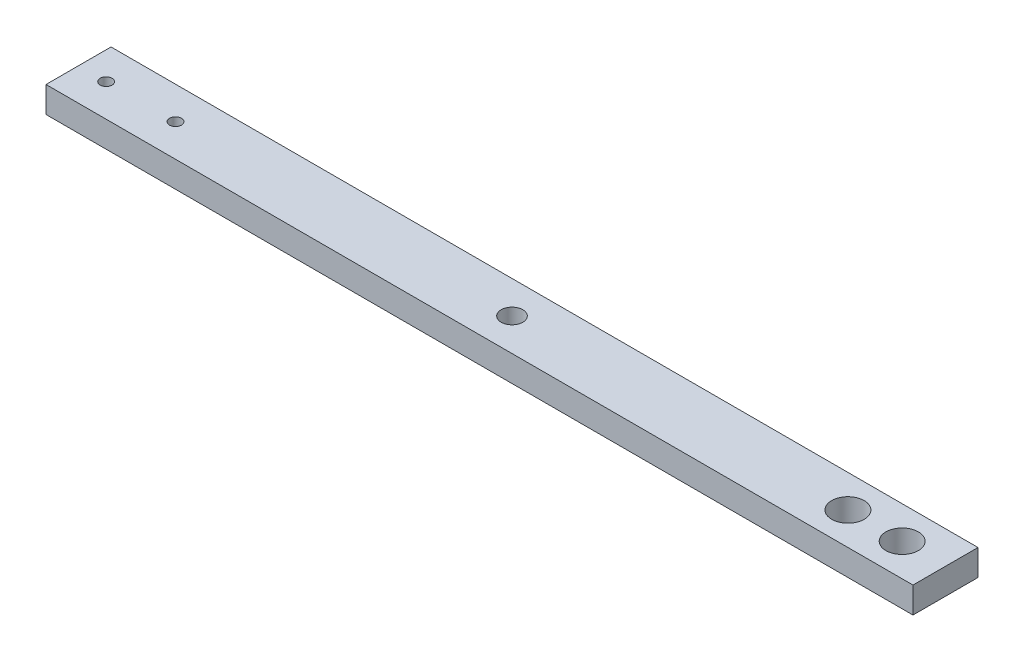
ISO-10303-21;
HEADER;
FILE_DESCRIPTION(('STEP AP214'),'2;1');
FILE_NAME('part.step','',(''),(''),'','','');
FILE_SCHEMA(('AUTOMOTIVE_DESIGN { 1 0 10303 214 1 1 1 1 }'));
ENDSEC;
DATA;
#1=APPLICATION_CONTEXT('core data for automotive mechanical design processes');
#2=APPLICATION_PROTOCOL_DEFINITION('international standard','automotive_design',2000,#1);
#3=PRODUCT_CONTEXT('',#1,'mechanical');
#4=PRODUCT('Part','Part','',(#3));
#5=PRODUCT_RELATED_PRODUCT_CATEGORY('part','',(#4));
#6=PRODUCT_DEFINITION_FORMATION('','',#4);
#7=PRODUCT_DEFINITION_CONTEXT('part definition',#1,'design');
#8=PRODUCT_DEFINITION('design','',#6,#7);
#9=PRODUCT_DEFINITION_SHAPE('','',#8);
#10=(LENGTH_UNIT() NAMED_UNIT(*) SI_UNIT(.MILLI.,.METRE.));
#11=(NAMED_UNIT(*) PLANE_ANGLE_UNIT() SI_UNIT($,.RADIAN.));
#12=(NAMED_UNIT(*) SI_UNIT($,.STERADIAN.) SOLID_ANGLE_UNIT());
#13=UNCERTAINTY_MEASURE_WITH_UNIT(LENGTH_MEASURE(1.E-05),#10,'distance_accuracy_value','');
#14=(GEOMETRIC_REPRESENTATION_CONTEXT(3) GLOBAL_UNCERTAINTY_ASSIGNED_CONTEXT((#13)) GLOBAL_UNIT_ASSIGNED_CONTEXT((#10,
#11,#12)) REPRESENTATION_CONTEXT('',''));
#15=CARTESIAN_POINT('',(0.,0.,0.));
#16=DIRECTION('',(0.,0.,1.));
#17=DIRECTION('',(1.,0.,0.));
#18=AXIS2_PLACEMENT_3D('',#15,#16,#17);
#19=CARTESIAN_POINT('',(0.,12.,0.));
#20=DIRECTION('',(0.,-1.,0.));
#21=DIRECTION('',(0.,0.,-1.));
#22=AXIS2_PLACEMENT_3D('',#19,#20,#21);
#23=PLANE('',#22);
#24=CARTESIAN_POINT('',(180.,12.,0.));
#25=DIRECTION('',(0.,-1.,0.));
#26=DIRECTION('',(0.,0.,-1.));
#27=AXIS2_PLACEMENT_3D('',#24,#25,#26);
#28=CIRCLE('',#27,7.50000000000001);
#29=CARTESIAN_POINT('',(180.,12.,-7.50000000000001));
#30=VERTEX_POINT('',#29);
#31=EDGE_CURVE('E156',#30,#30,#28,.F.);
#32=ORIENTED_EDGE('',*,*,#31,.F.);
#33=EDGE_LOOP('',(#32));
#34=FACE_BOUND('',#33,.T.);
#35=CARTESIAN_POINT('',(155.,12.,0.));
#36=DIRECTION('',(0.,-1.,0.));
#37=DIRECTION('',(0.,0.,-1.));
#38=AXIS2_PLACEMENT_3D('',#35,#36,#37);
#39=CIRCLE('',#38,7.50000000000001);
#40=CARTESIAN_POINT('',(155.,12.,-7.50000000000001));
#41=VERTEX_POINT('',#40);
#42=EDGE_CURVE('E163',#41,#41,#39,.F.);
#43=ORIENTED_EDGE('',*,*,#42,.F.);
#44=EDGE_LOOP('',(#43));
#45=FACE_BOUND('',#44,.T.);
#46=DIRECTION('',(0.,0.,-1.));
#47=VECTOR('',#46,1.);
#48=CARTESIAN_POINT('',(200.,12.,15.));
#49=LINE('',#48,#47);
#50=CARTESIAN_POINT('',(200.,12.,15.));
#51=VERTEX_POINT('',#50);
#52=CARTESIAN_POINT('',(200.,12.,-15.));
#53=VERTEX_POINT('',#52);
#54=EDGE_CURVE('E98',#51,#53,#49,.T.);
#55=ORIENTED_EDGE('',*,*,#54,.T.);
#56=DIRECTION('',(-1.,0.,0.));
#57=VECTOR('',#56,1.);
#58=CARTESIAN_POINT('',(-200.,12.,-15.));
#59=LINE('',#58,#57);
#60=CARTESIAN_POINT('',(-200.,12.,-15.));
#61=VERTEX_POINT('',#60);
#62=EDGE_CURVE('E93',#53,#61,#59,.T.);
#63=ORIENTED_EDGE('',*,*,#62,.T.);
#64=DIRECTION('',(0.,0.,1.));
#65=VECTOR('',#64,1.);
#66=CARTESIAN_POINT('',(-200.,12.,15.));
#67=LINE('',#66,#65);
#68=CARTESIAN_POINT('',(-200.,12.,15.));
#69=VERTEX_POINT('',#68);
#70=EDGE_CURVE('E96',#61,#69,#67,.T.);
#71=ORIENTED_EDGE('',*,*,#70,.T.);
#72=DIRECTION('',(1.,0.,0.));
#73=VECTOR('',#72,1.);
#74=CARTESIAN_POINT('',(-200.,12.,15.));
#75=LINE('',#74,#73);
#76=EDGE_CURVE('E63',#69,#51,#75,.T.);
#77=ORIENTED_EDGE('',*,*,#76,.T.);
#78=EDGE_LOOP('',(#55,#63,#71,#77));
#79=FACE_BOUND('',#78,.T.);
#80=CARTESIAN_POINT('',(0.,12.,0.));
#81=DIRECTION('',(0.,1.,0.));
#82=DIRECTION('',(0.,0.,1.));
#83=AXIS2_PLACEMENT_3D('',#80,#81,#82);
#84=CIRCLE('',#83,5.);
#85=CARTESIAN_POINT('',(0.,12.,5.));
#86=VERTEX_POINT('',#85);
#87=EDGE_CURVE('E118',#86,#86,#84,.T.);
#88=ORIENTED_EDGE('',*,*,#87,.F.);
#89=EDGE_LOOP('',(#88));
#90=FACE_BOUND('',#89,.T.);
#91=CARTESIAN_POINT('',(-187.25,12.,0.));
#92=DIRECTION('',(0.,1.,0.));
#93=DIRECTION('',(0.,0.,1.));
#94=AXIS2_PLACEMENT_3D('',#91,#92,#93);
#95=CIRCLE('',#94,2.75000000000001);
#96=CARTESIAN_POINT('',(-187.25,12.,2.75000000000001));
#97=VERTEX_POINT('',#96);
#98=EDGE_CURVE('E140',#97,#97,#95,.T.);
#99=ORIENTED_EDGE('',*,*,#98,.F.);
#100=EDGE_LOOP('',(#99));
#101=FACE_BOUND('',#100,.T.);
#102=CARTESIAN_POINT('',(-155.25,12.,0.));
#103=DIRECTION('',(0.,1.,0.));
#104=DIRECTION('',(0.,0.,1.));
#105=AXIS2_PLACEMENT_3D('',#102,#103,#104);
#106=CIRCLE('',#105,2.75000000000001);
#107=CARTESIAN_POINT('',(-155.25,12.,2.75000000000001));
#108=VERTEX_POINT('',#107);
#109=EDGE_CURVE('E148',#108,#108,#106,.T.);
#110=ORIENTED_EDGE('',*,*,#109,.F.);
#111=EDGE_LOOP('',(#110));
#112=FACE_BOUND('',#111,.T.);
#113=ADVANCED_FACE('F45',(#34,#45,#79,#90,#101,#112),#23,.F.);
#114=CARTESIAN_POINT('',(0.,0.,0.));
#115=DIRECTION('',(0.,-1.,0.));
#116=DIRECTION('',(0.,0.,-1.));
#117=AXIS2_PLACEMENT_3D('',#114,#115,#116);
#118=PLANE('',#117);
#119=CARTESIAN_POINT('',(180.,0.,0.));
#120=DIRECTION('',(0.,1.,0.));
#121=DIRECTION('',(0.,0.,1.));
#122=AXIS2_PLACEMENT_3D('',#119,#120,#121);
#123=CIRCLE('',#122,7.50000000000001);
#124=CARTESIAN_POINT('',(180.,0.,7.50000000000001));
#125=VERTEX_POINT('',#124);
#126=EDGE_CURVE('E167',#125,#125,#123,.T.);
#127=ORIENTED_EDGE('',*,*,#126,.T.);
#128=EDGE_LOOP('',(#127));
#129=FACE_BOUND('',#128,.T.);
#130=CARTESIAN_POINT('',(155.,0.,0.));
#131=DIRECTION('',(0.,1.,0.));
#132=DIRECTION('',(0.,0.,1.));
#133=AXIS2_PLACEMENT_3D('',#130,#131,#132);
#134=CIRCLE('',#133,7.50000000000001);
#135=CARTESIAN_POINT('',(155.,0.,7.50000000000002));
#136=VERTEX_POINT('',#135);
#137=EDGE_CURVE('E168',#136,#136,#134,.T.);
#138=ORIENTED_EDGE('',*,*,#137,.T.);
#139=EDGE_LOOP('',(#138));
#140=FACE_BOUND('',#139,.T.);
#141=CARTESIAN_POINT('',(-187.25,0.,0.));
#142=DIRECTION('',(0.,1.,0.));
#143=DIRECTION('',(0.,0.,1.));
#144=AXIS2_PLACEMENT_3D('',#141,#142,#143);
#145=CIRCLE('',#144,2.75000000000001);
#146=CARTESIAN_POINT('',(-187.25,0.,2.75000000000001));
#147=VERTEX_POINT('',#146);
#148=EDGE_CURVE('E144',#147,#147,#145,.T.);
#149=ORIENTED_EDGE('',*,*,#148,.T.);
#150=EDGE_LOOP('',(#149));
#151=FACE_BOUND('',#150,.T.);
#152=DIRECTION('',(0.,0.,-1.));
#153=VECTOR('',#152,1.);
#154=CARTESIAN_POINT('',(200.,0.,15.));
#155=LINE('',#154,#153);
#156=CARTESIAN_POINT('',(200.,0.,15.));
#157=VERTEX_POINT('',#156);
#158=CARTESIAN_POINT('',(200.,0.,-15.));
#159=VERTEX_POINT('',#158);
#160=EDGE_CURVE('E114',#157,#159,#155,.T.);
#161=ORIENTED_EDGE('',*,*,#160,.F.);
#162=DIRECTION('',(1.,0.,0.));
#163=VECTOR('',#162,1.);
#164=CARTESIAN_POINT('',(-200.,0.,15.));
#165=LINE('',#164,#163);
#166=CARTESIAN_POINT('',(-200.,0.,15.));
#167=VERTEX_POINT('',#166);
#168=EDGE_CURVE('E86',#167,#157,#165,.T.);
#169=ORIENTED_EDGE('',*,*,#168,.F.);
#170=DIRECTION('',(0.,0.,1.));
#171=VECTOR('',#170,1.);
#172=CARTESIAN_POINT('',(-200.,0.,15.));
#173=LINE('',#172,#171);
#174=CARTESIAN_POINT('',(-200.,0.,-15.));
#175=VERTEX_POINT('',#174);
#176=EDGE_CURVE('E80',#175,#167,#173,.T.);
#177=ORIENTED_EDGE('',*,*,#176,.F.);
#178=DIRECTION('',(-1.,0.,0.));
#179=VECTOR('',#178,1.);
#180=CARTESIAN_POINT('',(-200.,0.,-15.));
#181=LINE('',#180,#179);
#182=EDGE_CURVE('E103',#159,#175,#181,.T.);
#183=ORIENTED_EDGE('',*,*,#182,.F.);
#184=EDGE_LOOP('',(#161,#169,#177,#183));
#185=FACE_BOUND('',#184,.T.);
#186=CARTESIAN_POINT('',(0.,0.,0.));
#187=DIRECTION('',(0.,1.,0.));
#188=DIRECTION('',(0.,0.,1.));
#189=AXIS2_PLACEMENT_3D('',#186,#187,#188);
#190=CIRCLE('',#189,5.);
#191=CARTESIAN_POINT('',(0.,0.,5.));
#192=VERTEX_POINT('',#191);
#193=EDGE_CURVE('E136',#192,#192,#190,.T.);
#194=ORIENTED_EDGE('',*,*,#193,.T.);
#195=EDGE_LOOP('',(#194));
#196=FACE_BOUND('',#195,.T.);
#197=CARTESIAN_POINT('',(-155.25,0.,0.));
#198=DIRECTION('',(0.,1.,0.));
#199=DIRECTION('',(0.,0.,1.));
#200=AXIS2_PLACEMENT_3D('',#197,#198,#199);
#201=CIRCLE('',#200,2.75000000000001);
#202=CARTESIAN_POINT('',(-155.25,0.,2.75000000000001));
#203=VERTEX_POINT('',#202);
#204=EDGE_CURVE('E152',#203,#203,#201,.T.);
#205=ORIENTED_EDGE('',*,*,#204,.T.);
#206=EDGE_LOOP('',(#205));
#207=FACE_BOUND('',#206,.T.);
#208=ADVANCED_FACE('F131',(#129,#140,#151,#185,#196,#207),#118,.T.);
#209=CARTESIAN_POINT('',(200.,12.,15.));
#210=DIRECTION('',(-1.,0.,0.));
#211=DIRECTION('',(0.,0.,1.));
#212=AXIS2_PLACEMENT_3D('',#209,#210,#211);
#213=PLANE('',#212);
#214=ORIENTED_EDGE('',*,*,#160,.T.);
#215=DIRECTION('',(0.,-1.,0.));
#216=VECTOR('',#215,1.);
#217=CARTESIAN_POINT('',(200.,12.,-15.));
#218=LINE('',#217,#216);
#219=EDGE_CURVE('E11',#53,#159,#218,.T.);
#220=ORIENTED_EDGE('',*,*,#219,.F.);
#221=ORIENTED_EDGE('',*,*,#54,.F.);
#222=DIRECTION('',(0.,-1.,0.));
#223=VECTOR('',#222,1.);
#224=CARTESIAN_POINT('',(200.,12.,15.));
#225=LINE('',#224,#223);
#226=EDGE_CURVE('E110',#51,#157,#225,.T.);
#227=ORIENTED_EDGE('',*,*,#226,.T.);
#228=EDGE_LOOP('',(#214,#220,#221,#227));
#229=FACE_BOUND('',#228,.T.);
#230=ADVANCED_FACE('F47',(#229),#213,.F.);
#231=CARTESIAN_POINT('',(-200.,12.,-15.));
#232=DIRECTION('',(0.,0.,1.));
#233=DIRECTION('',(1.,0.,0.));
#234=AXIS2_PLACEMENT_3D('',#231,#232,#233);
#235=PLANE('',#234);
#236=ORIENTED_EDGE('',*,*,#182,.T.);
#237=DIRECTION('',(0.,-1.,0.));
#238=VECTOR('',#237,1.);
#239=CARTESIAN_POINT('',(-200.,12.,-15.));
#240=LINE('',#239,#238);
#241=EDGE_CURVE('E55',#61,#175,#240,.T.);
#242=ORIENTED_EDGE('',*,*,#241,.F.);
#243=ORIENTED_EDGE('',*,*,#62,.F.);
#244=ORIENTED_EDGE('',*,*,#219,.T.);
#245=EDGE_LOOP('',(#236,#242,#243,#244));
#246=FACE_BOUND('',#245,.T.);
#247=ADVANCED_FACE('F102',(#246),#235,.F.);
#248=CARTESIAN_POINT('',(-200.,12.,15.));
#249=DIRECTION('',(1.,0.,0.));
#250=DIRECTION('',(0.,0.,-1.));
#251=AXIS2_PLACEMENT_3D('',#248,#249,#250);
#252=PLANE('',#251);
#253=ORIENTED_EDGE('',*,*,#176,.T.);
#254=DIRECTION('',(0.,-1.,0.));
#255=VECTOR('',#254,1.);
#256=CARTESIAN_POINT('',(-200.,12.,15.));
#257=LINE('',#256,#255);
#258=EDGE_CURVE('E105',#69,#167,#257,.T.);
#259=ORIENTED_EDGE('',*,*,#258,.F.);
#260=ORIENTED_EDGE('',*,*,#70,.F.);
#261=ORIENTED_EDGE('',*,*,#241,.T.);
#262=EDGE_LOOP('',(#253,#259,#260,#261));
#263=FACE_BOUND('',#262,.T.);
#264=ADVANCED_FACE('F106',(#263),#252,.F.);
#265=CARTESIAN_POINT('',(-200.,12.,15.));
#266=DIRECTION('',(0.,0.,-1.));
#267=DIRECTION('',(-1.,0.,0.));
#268=AXIS2_PLACEMENT_3D('',#265,#266,#267);
#269=PLANE('',#268);
#270=ORIENTED_EDGE('',*,*,#168,.T.);
#271=ORIENTED_EDGE('',*,*,#226,.F.);
#272=ORIENTED_EDGE('',*,*,#76,.F.);
#273=ORIENTED_EDGE('',*,*,#258,.T.);
#274=EDGE_LOOP('',(#270,#271,#272,#273));
#275=FACE_BOUND('',#274,.T.);
#276=ADVANCED_FACE('F128',(#275),#269,.F.);
#277=CARTESIAN_POINT('',(0.,12.,0.));
#278=DIRECTION('',(0.,-1.,0.));
#279=DIRECTION('',(0.,0.,-1.));
#280=AXIS2_PLACEMENT_3D('',#277,#278,#279);
#281=CYLINDRICAL_SURFACE('',#280,5.);
#282=ORIENTED_EDGE('',*,*,#87,.T.);
#283=EDGE_LOOP('',(#282));
#284=FACE_BOUND('',#283,.T.);
#285=ORIENTED_EDGE('',*,*,#193,.F.);
#286=EDGE_LOOP('',(#285));
#287=FACE_BOUND('',#286,.T.);
#288=ADVANCED_FACE('F205',(#284,#287),#281,.F.);
#289=CARTESIAN_POINT('',(-187.25,12.,0.));
#290=DIRECTION('',(0.,-1.,0.));
#291=DIRECTION('',(0.,0.,-1.));
#292=AXIS2_PLACEMENT_3D('',#289,#290,#291);
#293=CYLINDRICAL_SURFACE('',#292,2.75000000000001);
#294=ORIENTED_EDGE('',*,*,#98,.T.);
#295=EDGE_LOOP('',(#294));
#296=FACE_BOUND('',#295,.T.);
#297=ORIENTED_EDGE('',*,*,#148,.F.);
#298=EDGE_LOOP('',(#297));
#299=FACE_BOUND('',#298,.T.);
#300=ADVANCED_FACE('F198',(#296,#299),#293,.F.);
#301=CARTESIAN_POINT('',(-155.25,12.,0.));
#302=DIRECTION('',(0.,-1.,0.));
#303=DIRECTION('',(0.,0.,-1.));
#304=AXIS2_PLACEMENT_3D('',#301,#302,#303);
#305=CYLINDRICAL_SURFACE('',#304,2.75000000000001);
#306=ORIENTED_EDGE('',*,*,#109,.T.);
#307=EDGE_LOOP('',(#306));
#308=FACE_BOUND('',#307,.T.);
#309=ORIENTED_EDGE('',*,*,#204,.F.);
#310=EDGE_LOOP('',(#309));
#311=FACE_BOUND('',#310,.T.);
#312=ADVANCED_FACE('F191',(#308,#311),#305,.F.);
#313=CARTESIAN_POINT('',(155.,20.,0.));
#314=DIRECTION('',(0.,-1.,0.));
#315=DIRECTION('',(0.,0.,-1.));
#316=AXIS2_PLACEMENT_3D('',#313,#314,#315);
#317=CYLINDRICAL_SURFACE('',#316,7.50000000000001);
#318=ORIENTED_EDGE('',*,*,#137,.F.);
#319=EDGE_LOOP('',(#318));
#320=FACE_BOUND('',#319,.T.);
#321=ORIENTED_EDGE('',*,*,#42,.T.);
#322=EDGE_LOOP('',(#321));
#323=FACE_BOUND('',#322,.T.);
#324=ADVANCED_FACE('F181',(#320,#323),#317,.F.);
#325=CARTESIAN_POINT('',(180.,20.,0.));
#326=DIRECTION('',(0.,-1.,0.));
#327=DIRECTION('',(0.,0.,-1.));
#328=AXIS2_PLACEMENT_3D('',#325,#326,#327);
#329=CYLINDRICAL_SURFACE('',#328,7.50000000000001);
#330=ORIENTED_EDGE('',*,*,#126,.F.);
#331=EDGE_LOOP('',(#330));
#332=FACE_BOUND('',#331,.T.);
#333=ORIENTED_EDGE('',*,*,#31,.T.);
#334=EDGE_LOOP('',(#333));
#335=FACE_BOUND('',#334,.T.);
#336=ADVANCED_FACE('F178',(#332,#335),#329,.F.);
#337=CLOSED_SHELL('',(#113,#208,#230,#247,#264,#276,#288,#300,#312,#324,#336));
#338=MANIFOLD_SOLID_BREP('B2',#337);
#339=ADVANCED_BREP_SHAPE_REPRESENTATION('',(#18,#338),#14);
#340=SHAPE_DEFINITION_REPRESENTATION(#9,#339);
ENDSEC;
END-ISO-10303-21;
